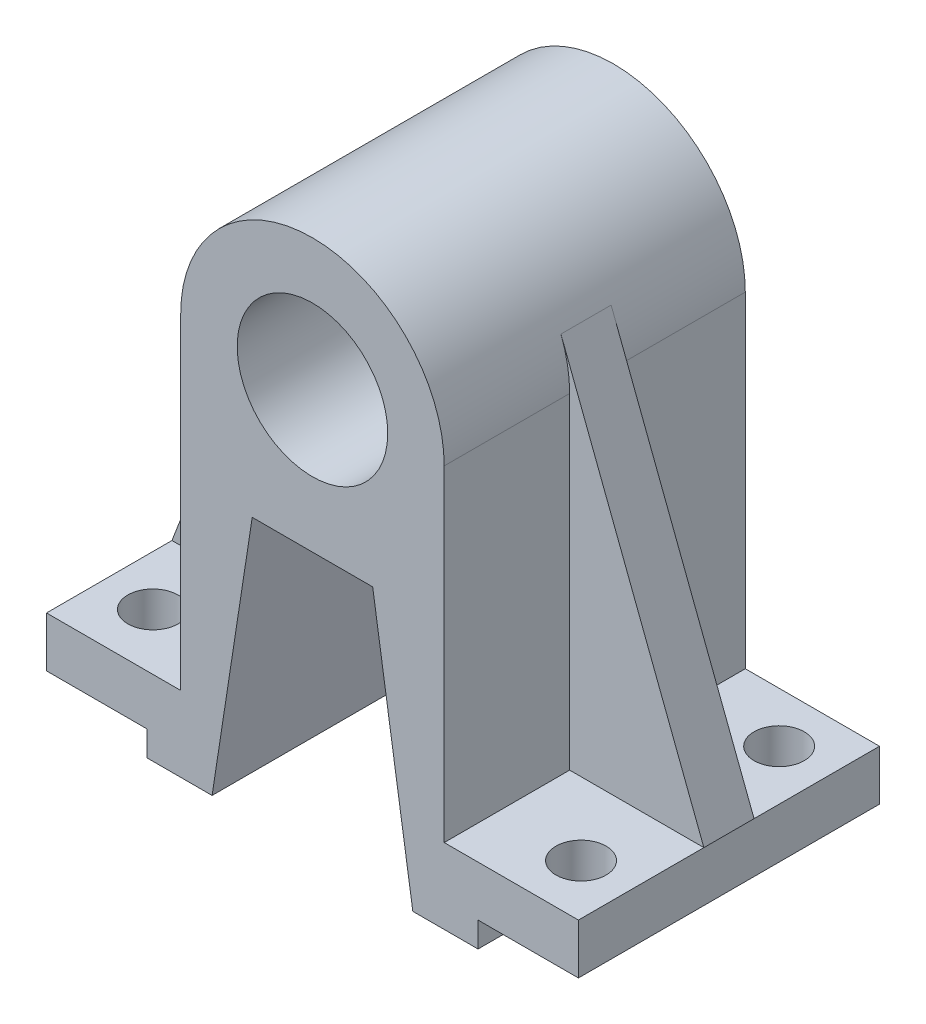
ISO-10303-21;
HEADER;
FILE_DESCRIPTION(('STEP AP214'),'2;1');
FILE_NAME('part.step','',(''),(''),'','','');
FILE_SCHEMA(('AUTOMOTIVE_DESIGN { 1 0 10303 214 1 1 1 1 }'));
ENDSEC;
DATA;
#1=APPLICATION_CONTEXT('core data for automotive mechanical design processes');
#2=APPLICATION_PROTOCOL_DEFINITION('international standard','automotive_design',2000,#1);
#3=PRODUCT_CONTEXT('',#1,'mechanical');
#4=PRODUCT('Part','Part','',(#3));
#5=PRODUCT_RELATED_PRODUCT_CATEGORY('part','',(#4));
#6=PRODUCT_DEFINITION_FORMATION('','',#4);
#7=PRODUCT_DEFINITION_CONTEXT('part definition',#1,'design');
#8=PRODUCT_DEFINITION('design','',#6,#7);
#9=PRODUCT_DEFINITION_SHAPE('','',#8);
#10=(LENGTH_UNIT() NAMED_UNIT(*) SI_UNIT(.MILLI.,.METRE.));
#11=(NAMED_UNIT(*) PLANE_ANGLE_UNIT() SI_UNIT($,.RADIAN.));
#12=(NAMED_UNIT(*) SI_UNIT($,.STERADIAN.) SOLID_ANGLE_UNIT());
#13=UNCERTAINTY_MEASURE_WITH_UNIT(LENGTH_MEASURE(1.E-05),#10,'distance_accuracy_value','');
#14=(GEOMETRIC_REPRESENTATION_CONTEXT(3) GLOBAL_UNCERTAINTY_ASSIGNED_CONTEXT((#13)) GLOBAL_UNIT_ASSIGNED_CONTEXT((#10,
#11,#12)) REPRESENTATION_CONTEXT('',''));
#15=CARTESIAN_POINT('',(0.,0.,0.));
#16=DIRECTION('',(0.,0.,1.));
#17=DIRECTION('',(1.,0.,0.));
#18=AXIS2_PLACEMENT_3D('',#15,#16,#17);
#19=CARTESIAN_POINT('',(0.,-60.2504582340665,-30.));
#20=DIRECTION('',(0.,-1.,0.));
#21=DIRECTION('',(0.,0.,-1.));
#22=AXIS2_PLACEMENT_3D('',#19,#20,#21);
#23=PLANE('',#22);
#24=CARTESIAN_POINT('',(-44.4977725785209,-60.2504582340665,-20.));
#25=DIRECTION('',(0.,1.,0.));
#26=DIRECTION('',(0.,0.,1.));
#27=AXIS2_PLACEMENT_3D('',#24,#25,#26);
#28=CIRCLE('',#27,5.);
#29=CARTESIAN_POINT('',(-44.4977725785209,-60.2504582340665,-15.));
#30=VERTEX_POINT('',#29);
#31=EDGE_CURVE('E308',#30,#30,#28,.T.);
#32=ORIENTED_EDGE('',*,*,#31,.F.);
#33=EDGE_LOOP('',(#32));
#34=FACE_BOUND('',#33,.T.);
#35=DIRECTION('',(1.,0.,0.));
#36=VECTOR('',#35,1.);
#37=CARTESIAN_POINT('',(-26.8889773387645,-60.2504582340665,-5.));
#38=LINE('',#37,#36);
#39=CARTESIAN_POINT('',(-54.4977725785209,-60.2504582340665,-5.));
#40=VERTEX_POINT('',#39);
#41=CARTESIAN_POINT('',(-27.7507042967795,-60.2504582340665,-5.));
#42=VERTEX_POINT('',#41);
#43=EDGE_CURVE('E476',#40,#42,#38,.T.);
#44=ORIENTED_EDGE('',*,*,#43,.T.);
#45=DIRECTION('',(0.,0.,1.));
#46=VECTOR('',#45,1.);
#47=CARTESIAN_POINT('',(-27.7507042967795,-60.2504582340665,-30.));
#48=LINE('',#47,#46);
#49=CARTESIAN_POINT('',(-27.7507042967795,-60.2504582340665,-30.));
#50=VERTEX_POINT('',#49);
#51=EDGE_CURVE('E455',#50,#42,#48,.T.);
#52=ORIENTED_EDGE('',*,*,#51,.F.);
#53=DIRECTION('',(1.,0.,0.));
#54=VECTOR('',#53,1.);
#55=CARTESIAN_POINT('',(0.,-60.2504582340665,-30.));
#56=LINE('',#55,#54);
#57=CARTESIAN_POINT('',(-54.4977725785209,-60.2504582340665,-30.));
#58=VERTEX_POINT('',#57);
#59=EDGE_CURVE('E351',#58,#50,#56,.T.);
#60=ORIENTED_EDGE('',*,*,#59,.F.);
#61=DIRECTION('',(0.,0.,1.));
#62=VECTOR('',#61,1.);
#63=CARTESIAN_POINT('',(-54.4977725785209,-60.2504582340665,-30.));
#64=LINE('',#63,#62);
#65=EDGE_CURVE('E451',#58,#40,#64,.T.);
#66=ORIENTED_EDGE('',*,*,#65,.T.);
#67=EDGE_LOOP('',(#44,#52,#60,#66));
#68=FACE_BOUND('',#67,.T.);
#69=ADVANCED_FACE('F99',(#34,#68),#23,.F.);
#70=CARTESIAN_POINT('',(-27.7507042967795,0.,-30.));
#71=DIRECTION('',(-1.,0.,0.));
#72=DIRECTION('',(0.,-1.,0.));
#73=AXIS2_PLACEMENT_3D('',#70,#71,#72);
#74=PLANE('',#73);
#75=ORIENTED_EDGE('',*,*,#51,.T.);
#76=DIRECTION('',(0.,1.,0.));
#77=VECTOR('',#76,1.);
#78=CARTESIAN_POINT('',(-27.7507042967795,0.,-5.));
#79=LINE('',#78,#77);
#80=CARTESIAN_POINT('',(-27.7507042967795,4.74954176593344,-5.));
#81=VERTEX_POINT('',#80);
#82=EDGE_CURVE('E107',#42,#81,#79,.T.);
#83=ORIENTED_EDGE('',*,*,#82,.T.);
#84=DIRECTION('',(0.,0.,1.));
#85=VECTOR('',#84,1.);
#86=CARTESIAN_POINT('',(-27.7507042967795,4.74954176593344,-30.));
#87=LINE('',#86,#85);
#88=CARTESIAN_POINT('',(-27.7507042967795,4.74954176593344,-30.));
#89=VERTEX_POINT('',#88);
#90=EDGE_CURVE('E342',#89,#81,#87,.T.);
#91=ORIENTED_EDGE('',*,*,#90,.F.);
#92=DIRECTION('',(0.,-1.,0.));
#93=VECTOR('',#92,1.);
#94=CARTESIAN_POINT('',(-27.7507042967795,0.,-30.));
#95=LINE('',#94,#93);
#96=EDGE_CURVE('E348',#89,#50,#95,.T.);
#97=ORIENTED_EDGE('',*,*,#96,.T.);
#98=EDGE_LOOP('',(#75,#83,#91,#97));
#99=FACE_BOUND('',#98,.T.);
#100=ADVANCED_FACE('F462',(#99),#74,.T.);
#101=CARTESIAN_POINT('',(0.,-60.2504582340665,-30.));
#102=DIRECTION('',(0.,-1.,0.));
#103=DIRECTION('',(0.,0.,-1.));
#104=AXIS2_PLACEMENT_3D('',#101,#102,#103);
#105=PLANE('',#104);
#106=CARTESIAN_POINT('',(41.5022274214791,-60.2504582340665,-20.));
#107=DIRECTION('',(0.,1.,0.));
#108=DIRECTION('',(0.,0.,1.));
#109=AXIS2_PLACEMENT_3D('',#106,#107,#108);
#110=CIRCLE('',#109,5.);
#111=CARTESIAN_POINT('',(41.5022274214791,-60.2504582340665,-15.));
#112=VERTEX_POINT('',#111);
#113=EDGE_CURVE('E304',#112,#112,#110,.T.);
#114=ORIENTED_EDGE('',*,*,#113,.F.);
#115=EDGE_LOOP('',(#114));
#116=FACE_BOUND('',#115,.T.);
#117=DIRECTION('',(1.,0.,0.));
#118=VECTOR('',#117,1.);
#119=CARTESIAN_POINT('',(51.5022274214791,-60.2504582340665,-5.));
#120=LINE('',#119,#118);
#121=CARTESIAN_POINT('',(24.7551591397377,-60.2504582340665,-5.));
#122=VERTEX_POINT('',#121);
#123=CARTESIAN_POINT('',(51.5022274214791,-60.2504582340665,-5.));
#124=VERTEX_POINT('',#123);
#125=EDGE_CURVE('E268',#122,#124,#120,.T.);
#126=ORIENTED_EDGE('',*,*,#125,.T.);
#127=DIRECTION('',(0.,0.,1.));
#128=VECTOR('',#127,1.);
#129=CARTESIAN_POINT('',(51.5022274214791,-60.2504582340665,-30.));
#130=LINE('',#129,#128);
#131=CARTESIAN_POINT('',(51.5022274214791,-60.2504582340665,-30.));
#132=VERTEX_POINT('',#131);
#133=EDGE_CURVE('E417',#132,#124,#130,.T.);
#134=ORIENTED_EDGE('',*,*,#133,.F.);
#135=DIRECTION('',(1.,0.,0.));
#136=VECTOR('',#135,1.);
#137=CARTESIAN_POINT('',(0.,-60.2504582340665,-30.));
#138=LINE('',#137,#136);
#139=CARTESIAN_POINT('',(24.7551591397377,-60.2504582340665,-30.));
#140=VERTEX_POINT('',#139);
#141=EDGE_CURVE('E376',#140,#132,#138,.T.);
#142=ORIENTED_EDGE('',*,*,#141,.F.);
#143=DIRECTION('',(0.,0.,1.));
#144=VECTOR('',#143,1.);
#145=CARTESIAN_POINT('',(24.7551591397377,-60.2504582340665,-30.));
#146=LINE('',#145,#144);
#147=EDGE_CURVE('E341',#140,#122,#146,.T.);
#148=ORIENTED_EDGE('',*,*,#147,.T.);
#149=EDGE_LOOP('',(#126,#134,#142,#148));
#150=FACE_BOUND('',#149,.T.);
#151=ADVANCED_FACE('F510',(#116,#150),#105,.F.);
#152=CARTESIAN_POINT('',(24.7551591397378,0.,-30.));
#153=DIRECTION('',(-1.,0.,0.));
#154=DIRECTION('',(0.,-1.,0.));
#155=AXIS2_PLACEMENT_3D('',#152,#153,#154);
#156=PLANE('',#155);
#157=DIRECTION('',(0.,1.,0.));
#158=VECTOR('',#157,1.);
#159=CARTESIAN_POINT('',(24.7551591397378,0.,-5.));
#160=LINE('',#159,#158);
#161=CARTESIAN_POINT('',(24.7551591397378,4.74954176593344,-5.));
#162=VERTEX_POINT('',#161);
#163=EDGE_CURVE('E344',#122,#162,#160,.T.);
#164=ORIENTED_EDGE('',*,*,#163,.F.);
#165=ORIENTED_EDGE('',*,*,#147,.F.);
#166=DIRECTION('',(0.,-1.,0.));
#167=VECTOR('',#166,1.);
#168=CARTESIAN_POINT('',(24.7551591397378,0.,-30.));
#169=LINE('',#168,#167);
#170=CARTESIAN_POINT('',(24.7551591397378,4.74954176593344,-30.));
#171=VERTEX_POINT('',#170);
#172=EDGE_CURVE('E378',#171,#140,#169,.T.);
#173=ORIENTED_EDGE('',*,*,#172,.F.);
#174=DIRECTION('',(0.,0.,1.));
#175=VECTOR('',#174,1.);
#176=CARTESIAN_POINT('',(24.7551591397378,4.74954176593344,-30.));
#177=LINE('',#176,#175);
#178=EDGE_CURVE('E346',#171,#162,#177,.T.);
#179=ORIENTED_EDGE('',*,*,#178,.T.);
#180=EDGE_LOOP('',(#164,#165,#173,#179));
#181=FACE_BOUND('',#180,.T.);
#182=ADVANCED_FACE('F507',(#181),#156,.F.);
#183=CARTESIAN_POINT('',(-1.49777257852089,4.74954176593344,-30.));
#184=DIRECTION('',(0.,0.,1.));
#185=DIRECTION('',(1.,0.,0.));
#186=AXIS2_PLACEMENT_3D('',#183,#184,#185);
#187=CYLINDRICAL_SURFACE('',#186,26.2529317182586);
#188=CARTESIAN_POINT('',(-1.49777257852089,4.74954176593344,5.));
#189=DIRECTION('',(0.,0.,1.));
#190=DIRECTION('',(1.,0.,0.));
#191=AXIS2_PLACEMENT_3D('',#188,#189,#190);
#192=CIRCLE('',#191,26.2529317182586);
#193=CARTESIAN_POINT('',(-27.7507042967795,4.74954176593344,5.));
#194=VERTEX_POINT('',#193);
#195=CARTESIAN_POINT('',(-26.8889773387645,11.4206094935865,5.));
#196=VERTEX_POINT('',#195);
#197=EDGE_CURVE('E260',#194,#196,#192,.F.);
#198=ORIENTED_EDGE('',*,*,#197,.F.);
#199=CARTESIAN_POINT('',(-27.7507042967795,4.74954176593344,30.));
#200=VERTEX_POINT('',#199);
#201=EDGE_CURVE('E345',#194,#200,#87,.T.);
#202=ORIENTED_EDGE('',*,*,#201,.T.);
#203=CARTESIAN_POINT('',(-1.49777257852089,4.74954176593344,30.));
#204=DIRECTION('',(0.,0.,1.));
#205=DIRECTION('',(1.,0.,0.));
#206=AXIS2_PLACEMENT_3D('',#203,#204,#205);
#207=CIRCLE('',#206,26.2529317182586);
#208=CARTESIAN_POINT('',(24.7551591397378,4.74954176593344,30.));
#209=VERTEX_POINT('',#208);
#210=EDGE_CURVE('E338',#209,#200,#207,.T.);
#211=ORIENTED_EDGE('',*,*,#210,.F.);
#212=CARTESIAN_POINT('',(24.7551591397378,4.74954176593344,5.));
#213=VERTEX_POINT('',#212);
#214=EDGE_CURVE('E337',#213,#209,#177,.T.);
#215=ORIENTED_EDGE('',*,*,#214,.F.);
#216=CARTESIAN_POINT('',(-1.49777257852089,4.74954176593344,5.));
#217=DIRECTION('',(0.,0.,1.));
#218=DIRECTION('',(1.,0.,0.));
#219=AXIS2_PLACEMENT_3D('',#216,#217,#218);
#220=CIRCLE('',#219,26.2529317182586);
#221=CARTESIAN_POINT('',(23.0193645472082,14.1371085945502,5.));
#222=VERTEX_POINT('',#221);
#223=EDGE_CURVE('E122',#222,#213,#220,.F.);
#224=ORIENTED_EDGE('',*,*,#223,.F.);
#225=DIRECTION('',(0.,0.,-1.));
#226=VECTOR('',#225,1.);
#227=CARTESIAN_POINT('',(23.0193645472082,14.1371085945502,5.));
#228=LINE('',#227,#226);
#229=CARTESIAN_POINT('',(23.0193645472082,14.1371085945502,-5.));
#230=VERTEX_POINT('',#229);
#231=EDGE_CURVE('E291',#222,#230,#228,.T.);
#232=ORIENTED_EDGE('',*,*,#231,.T.);
#233=CARTESIAN_POINT('',(-1.49777257852089,4.74954176593344,-5.));
#234=DIRECTION('',(0.,0.,1.));
#235=DIRECTION('',(1.,0.,0.));
#236=AXIS2_PLACEMENT_3D('',#233,#234,#235);
#237=CIRCLE('',#236,26.2529317182586);
#238=EDGE_CURVE('E299',#230,#162,#237,.F.);
#239=ORIENTED_EDGE('',*,*,#238,.T.);
#240=ORIENTED_EDGE('',*,*,#178,.F.);
#241=CARTESIAN_POINT('',(-1.49777257852089,4.74954176593344,-30.));
#242=DIRECTION('',(0.,0.,1.));
#243=DIRECTION('',(1.,0.,0.));
#244=AXIS2_PLACEMENT_3D('',#241,#242,#243);
#245=CIRCLE('',#244,26.2529317182586);
#246=EDGE_CURVE('E334',#171,#89,#245,.T.);
#247=ORIENTED_EDGE('',*,*,#246,.T.);
#248=ORIENTED_EDGE('',*,*,#90,.T.);
#249=CARTESIAN_POINT('',(-1.49777257852089,4.74954176593344,-5.));
#250=DIRECTION('',(0.,0.,1.));
#251=DIRECTION('',(1.,0.,0.));
#252=AXIS2_PLACEMENT_3D('',#249,#250,#251);
#253=CIRCLE('',#252,26.2529317182586);
#254=CARTESIAN_POINT('',(-26.8889773387645,11.4206094935865,-5.));
#255=VERTEX_POINT('',#254);
#256=EDGE_CURVE('E114',#81,#255,#253,.F.);
#257=ORIENTED_EDGE('',*,*,#256,.T.);
#258=DIRECTION('',(0.,0.,-1.));
#259=VECTOR('',#258,1.);
#260=CARTESIAN_POINT('',(-26.8889773387645,11.4206094935865,5.));
#261=LINE('',#260,#259);
#262=EDGE_CURVE('E272',#196,#255,#261,.T.);
#263=ORIENTED_EDGE('',*,*,#262,.F.);
#264=EDGE_LOOP('',(#198,#202,#211,#215,#224,#232,#239,#240,#247,#248,#257,#263));
#265=FACE_BOUND('',#264,.T.);
#266=ADVANCED_FACE('F278',(#265),#187,.T.);
#267=CARTESIAN_POINT('',(0.,0.,30.));
#268=DIRECTION('',(0.,0.,1.));
#269=DIRECTION('',(1.,0.,0.));
#270=AXIS2_PLACEMENT_3D('',#267,#268,#269);
#271=PLANE('',#270);
#272=CARTESIAN_POINT('',(-1.49777257852089,4.74954176593344,30.));
#273=DIRECTION('',(0.,0.,1.));
#274=DIRECTION('',(1.,0.,0.));
#275=AXIS2_PLACEMENT_3D('',#272,#273,#274);
#276=CIRCLE('',#275,15.);
#277=CARTESIAN_POINT('',(13.5022274214791,4.74954176593344,30.));
#278=VERTEX_POINT('',#277);
#279=EDGE_CURVE('E327',#278,#278,#276,.T.);
#280=ORIENTED_EDGE('',*,*,#279,.F.);
#281=EDGE_LOOP('',(#280));
#282=FACE_BOUND('',#281,.T.);
#283=ORIENTED_EDGE('',*,*,#210,.T.);
#284=DIRECTION('',(0.,-1.,0.));
#285=VECTOR('',#284,1.);
#286=CARTESIAN_POINT('',(-27.7507042967795,0.,30.));
#287=LINE('',#286,#285);
#288=CARTESIAN_POINT('',(-27.7507042967795,-60.2504582340665,30.));
#289=VERTEX_POINT('',#288);
#290=EDGE_CURVE('E331',#200,#289,#287,.T.);
#291=ORIENTED_EDGE('',*,*,#290,.T.);
#292=DIRECTION('',(1.,0.,0.));
#293=VECTOR('',#292,1.);
#294=CARTESIAN_POINT('',(0.,-60.2504582340665,30.));
#295=LINE('',#294,#293);
#296=CARTESIAN_POINT('',(-54.4977725785209,-60.2504582340665,30.));
#297=VERTEX_POINT('',#296);
#298=EDGE_CURVE('E383',#297,#289,#295,.T.);
#299=ORIENTED_EDGE('',*,*,#298,.F.);
#300=DIRECTION('',(0.,1.,0.));
#301=VECTOR('',#300,1.);
#302=CARTESIAN_POINT('',(-54.497772578521,0.,30.));
#303=LINE('',#302,#301);
#304=CARTESIAN_POINT('',(-54.4977725785209,-70.2504582340665,30.));
#305=VERTEX_POINT('',#304);
#306=EDGE_CURVE('E386',#305,#297,#303,.T.);
#307=ORIENTED_EDGE('',*,*,#306,.F.);
#308=DIRECTION('',(-1.,0.,0.));
#309=VECTOR('',#308,1.);
#310=CARTESIAN_POINT('',(0.,-70.2504582340666,30.));
#311=LINE('',#310,#309);
#312=CARTESIAN_POINT('',(-34.4977725785209,-70.2504582340666,30.));
#313=VERTEX_POINT('',#312);
#314=EDGE_CURVE('E389',#313,#305,#311,.T.);
#315=ORIENTED_EDGE('',*,*,#314,.F.);
#316=DIRECTION('',(0.,1.,0.));
#317=VECTOR('',#316,1.);
#318=CARTESIAN_POINT('',(-34.4977725785209,0.,30.));
#319=LINE('',#318,#317);
#320=CARTESIAN_POINT('',(-34.4977725785209,-75.2504582340666,30.));
#321=VERTEX_POINT('',#320);
#322=EDGE_CURVE('E391',#321,#313,#319,.T.);
#323=ORIENTED_EDGE('',*,*,#322,.F.);
#324=DIRECTION('',(-1.,0.,0.));
#325=VECTOR('',#324,1.);
#326=CARTESIAN_POINT('',(0.,-75.2504582340666,30.));
#327=LINE('',#326,#325);
#328=CARTESIAN_POINT('',(-21.4977725785209,-75.2504582340666,30.));
#329=VERTEX_POINT('',#328);
#330=EDGE_CURVE('E393',#329,#321,#327,.T.);
#331=ORIENTED_EDGE('',*,*,#330,.F.);
#332=DIRECTION('',(-0.152057184253941,-0.988371697650617,0.));
#333=VECTOR('',#332,1.);
#334=CARTESIAN_POINT('',(-9.69139683054509,1.49098412777617,30.));
#335=LINE('',#334,#333);
#336=CARTESIAN_POINT('',(-13.4977725785209,-23.2504582340666,30.));
#337=VERTEX_POINT('',#336);
#338=EDGE_CURVE('E395',#337,#329,#335,.T.);
#339=ORIENTED_EDGE('',*,*,#338,.F.);
#340=DIRECTION('',(-1.,0.,0.));
#341=VECTOR('',#340,1.);
#342=CARTESIAN_POINT('',(0.,-23.2504582340666,30.));
#343=LINE('',#342,#341);
#344=CARTESIAN_POINT('',(10.5022274214791,-23.2504582340666,30.));
#345=VERTEX_POINT('',#344);
#346=EDGE_CURVE('E397',#345,#337,#343,.T.);
#347=ORIENTED_EDGE('',*,*,#346,.F.);
#348=DIRECTION('',(-0.152057184253941,0.988371697650617,0.));
#349=VECTOR('',#348,1.);
#350=CARTESIAN_POINT('',(6.76511283320369,1.04078658972364,30.));
#351=LINE('',#350,#349);
#352=CARTESIAN_POINT('',(18.5022274214791,-75.2504582340666,30.));
#353=VERTEX_POINT('',#352);
#354=EDGE_CURVE('E399',#353,#345,#351,.T.);
#355=ORIENTED_EDGE('',*,*,#354,.F.);
#356=DIRECTION('',(-1.,0.,0.));
#357=VECTOR('',#356,1.);
#358=CARTESIAN_POINT('',(0.,-75.2504582340666,30.));
#359=LINE('',#358,#357);
#360=CARTESIAN_POINT('',(31.5022274214791,-75.2504582340666,30.));
#361=VERTEX_POINT('',#360);
#362=EDGE_CURVE('E401',#361,#353,#359,.T.);
#363=ORIENTED_EDGE('',*,*,#362,.F.);
#364=DIRECTION('',(0.,-1.,0.));
#365=VECTOR('',#364,1.);
#366=CARTESIAN_POINT('',(31.5022274214791,0.,30.));
#367=LINE('',#366,#365);
#368=CARTESIAN_POINT('',(31.5022274214791,-70.2504582340666,30.));
#369=VERTEX_POINT('',#368);
#370=EDGE_CURVE('E403',#369,#361,#367,.T.);
#371=ORIENTED_EDGE('',*,*,#370,.F.);
#372=DIRECTION('',(-1.,0.,0.));
#373=VECTOR('',#372,1.);
#374=CARTESIAN_POINT('',(0.,-70.2504582340666,30.));
#375=LINE('',#374,#373);
#376=CARTESIAN_POINT('',(51.5022274214791,-70.2504582340665,30.));
#377=VERTEX_POINT('',#376);
#378=EDGE_CURVE('E405',#377,#369,#375,.T.);
#379=ORIENTED_EDGE('',*,*,#378,.F.);
#380=DIRECTION('',(0.,-1.,0.));
#381=VECTOR('',#380,1.);
#382=CARTESIAN_POINT('',(51.5022274214792,0.,30.));
#383=LINE('',#382,#381);
#384=CARTESIAN_POINT('',(51.5022274214791,-60.2504582340665,30.));
#385=VERTEX_POINT('',#384);
#386=EDGE_CURVE('E407',#385,#377,#383,.T.);
#387=ORIENTED_EDGE('',*,*,#386,.F.);
#388=DIRECTION('',(1.,0.,0.));
#389=VECTOR('',#388,1.);
#390=CARTESIAN_POINT('',(0.,-60.2504582340665,30.));
#391=LINE('',#390,#389);
#392=CARTESIAN_POINT('',(24.7551591397377,-60.2504582340665,30.));
#393=VERTEX_POINT('',#392);
#394=EDGE_CURVE('E409',#393,#385,#391,.T.);
#395=ORIENTED_EDGE('',*,*,#394,.F.);
#396=DIRECTION('',(0.,-1.,0.));
#397=VECTOR('',#396,1.);
#398=CARTESIAN_POINT('',(24.7551591397378,0.,30.));
#399=LINE('',#398,#397);
#400=EDGE_CURVE('E352',#209,#393,#399,.T.);
#401=ORIENTED_EDGE('',*,*,#400,.F.);
#402=EDGE_LOOP('',(#283,#291,#299,#307,#315,#323,#331,#339,#347,#355,#363,#371,#379,#387,#395,#401));
#403=FACE_BOUND('',#402,.T.);
#404=ADVANCED_FACE('F489',(#282,#403),#271,.T.);
#405=CARTESIAN_POINT('',(0.,0.,-30.));
#406=DIRECTION('',(0.,0.,1.));
#407=DIRECTION('',(1.,0.,0.));
#408=AXIS2_PLACEMENT_3D('',#405,#406,#407);
#409=PLANE('',#408);
#410=CARTESIAN_POINT('',(-1.49777257852089,4.74954176593344,-30.));
#411=DIRECTION('',(0.,0.,1.));
#412=DIRECTION('',(1.,0.,0.));
#413=AXIS2_PLACEMENT_3D('',#410,#411,#412);
#414=CIRCLE('',#413,15.);
#415=CARTESIAN_POINT('',(13.5022274214791,4.74954176593344,-30.));
#416=VERTEX_POINT('',#415);
#417=EDGE_CURVE('E328',#416,#416,#414,.T.);
#418=ORIENTED_EDGE('',*,*,#417,.T.);
#419=EDGE_LOOP('',(#418));
#420=FACE_BOUND('',#419,.T.);
#421=ORIENTED_EDGE('',*,*,#246,.F.);
#422=ORIENTED_EDGE('',*,*,#172,.T.);
#423=ORIENTED_EDGE('',*,*,#141,.T.);
#424=DIRECTION('',(0.,-1.,0.));
#425=VECTOR('',#424,1.);
#426=CARTESIAN_POINT('',(51.5022274214792,0.,-30.));
#427=LINE('',#426,#425);
#428=CARTESIAN_POINT('',(51.5022274214791,-70.2504582340665,-30.));
#429=VERTEX_POINT('',#428);
#430=EDGE_CURVE('E374',#132,#429,#427,.T.);
#431=ORIENTED_EDGE('',*,*,#430,.T.);
#432=DIRECTION('',(-1.,0.,0.));
#433=VECTOR('',#432,1.);
#434=CARTESIAN_POINT('',(0.,-70.2504582340666,-30.));
#435=LINE('',#434,#433);
#436=CARTESIAN_POINT('',(31.5022274214791,-70.2504582340666,-30.));
#437=VERTEX_POINT('',#436);
#438=EDGE_CURVE('E372',#429,#437,#435,.T.);
#439=ORIENTED_EDGE('',*,*,#438,.T.);
#440=DIRECTION('',(0.,-1.,0.));
#441=VECTOR('',#440,1.);
#442=CARTESIAN_POINT('',(31.5022274214791,0.,-30.));
#443=LINE('',#442,#441);
#444=CARTESIAN_POINT('',(31.5022274214791,-75.2504582340666,-30.));
#445=VERTEX_POINT('',#444);
#446=EDGE_CURVE('E370',#437,#445,#443,.T.);
#447=ORIENTED_EDGE('',*,*,#446,.T.);
#448=DIRECTION('',(-1.,0.,0.));
#449=VECTOR('',#448,1.);
#450=CARTESIAN_POINT('',(0.,-75.2504582340666,-30.));
#451=LINE('',#450,#449);
#452=CARTESIAN_POINT('',(18.5022274214791,-75.2504582340666,-30.));
#453=VERTEX_POINT('',#452);
#454=EDGE_CURVE('E368',#445,#453,#451,.T.);
#455=ORIENTED_EDGE('',*,*,#454,.T.);
#456=DIRECTION('',(-0.152057184253941,0.988371697650617,0.));
#457=VECTOR('',#456,1.);
#458=CARTESIAN_POINT('',(6.76511283320369,1.04078658972364,-30.));
#459=LINE('',#458,#457);
#460=CARTESIAN_POINT('',(10.5022274214791,-23.2504582340666,-30.));
#461=VERTEX_POINT('',#460);
#462=EDGE_CURVE('E366',#453,#461,#459,.T.);
#463=ORIENTED_EDGE('',*,*,#462,.T.);
#464=DIRECTION('',(-1.,0.,0.));
#465=VECTOR('',#464,1.);
#466=CARTESIAN_POINT('',(0.,-23.2504582340666,-30.));
#467=LINE('',#466,#465);
#468=CARTESIAN_POINT('',(-13.4977725785209,-23.2504582340666,-30.));
#469=VERTEX_POINT('',#468);
#470=EDGE_CURVE('E364',#461,#469,#467,.T.);
#471=ORIENTED_EDGE('',*,*,#470,.T.);
#472=DIRECTION('',(-0.152057184253941,-0.988371697650617,0.));
#473=VECTOR('',#472,1.);
#474=CARTESIAN_POINT('',(-9.69139683054509,1.49098412777617,-30.));
#475=LINE('',#474,#473);
#476=CARTESIAN_POINT('',(-21.4977725785209,-75.2504582340666,-30.));
#477=VERTEX_POINT('',#476);
#478=EDGE_CURVE('E362',#469,#477,#475,.T.);
#479=ORIENTED_EDGE('',*,*,#478,.T.);
#480=DIRECTION('',(-1.,0.,0.));
#481=VECTOR('',#480,1.);
#482=CARTESIAN_POINT('',(0.,-75.2504582340666,-30.));
#483=LINE('',#482,#481);
#484=CARTESIAN_POINT('',(-34.4977725785209,-75.2504582340666,-30.));
#485=VERTEX_POINT('',#484);
#486=EDGE_CURVE('E360',#477,#485,#483,.T.);
#487=ORIENTED_EDGE('',*,*,#486,.T.);
#488=DIRECTION('',(0.,1.,0.));
#489=VECTOR('',#488,1.);
#490=CARTESIAN_POINT('',(-34.4977725785209,0.,-30.));
#491=LINE('',#490,#489);
#492=CARTESIAN_POINT('',(-34.4977725785209,-70.2504582340666,-30.));
#493=VERTEX_POINT('',#492);
#494=EDGE_CURVE('E358',#485,#493,#491,.T.);
#495=ORIENTED_EDGE('',*,*,#494,.T.);
#496=DIRECTION('',(-1.,0.,0.));
#497=VECTOR('',#496,1.);
#498=CARTESIAN_POINT('',(0.,-70.2504582340666,-30.));
#499=LINE('',#498,#497);
#500=CARTESIAN_POINT('',(-54.4977725785209,-70.2504582340665,-30.));
#501=VERTEX_POINT('',#500);
#502=EDGE_CURVE('E356',#493,#501,#499,.T.);
#503=ORIENTED_EDGE('',*,*,#502,.T.);
#504=DIRECTION('',(0.,1.,0.));
#505=VECTOR('',#504,1.);
#506=CARTESIAN_POINT('',(-54.497772578521,0.,-30.));
#507=LINE('',#506,#505);
#508=EDGE_CURVE('E354',#501,#58,#507,.T.);
#509=ORIENTED_EDGE('',*,*,#508,.T.);
#510=ORIENTED_EDGE('',*,*,#59,.T.);
#511=ORIENTED_EDGE('',*,*,#96,.F.);
#512=EDGE_LOOP('',(#421,#422,#423,#431,#439,#447,#455,#463,#471,#479,#487,#495,#503,#509,#510,#511));
#513=FACE_BOUND('',#512,.T.);
#514=ADVANCED_FACE('F470',(#420,#513),#409,.F.);
#515=CARTESIAN_POINT('',(51.5022274214792,0.,-30.));
#516=DIRECTION('',(-1.,0.,0.));
#517=DIRECTION('',(0.,-1.,0.));
#518=AXIS2_PLACEMENT_3D('',#515,#516,#517);
#519=PLANE('',#518);
#520=ORIENTED_EDGE('',*,*,#386,.T.);
#521=DIRECTION('',(0.,0.,1.));
#522=VECTOR('',#521,1.);
#523=CARTESIAN_POINT('',(51.5022274214791,-70.2504582340665,-30.));
#524=LINE('',#523,#522);
#525=EDGE_CURVE('E421',#429,#377,#524,.T.);
#526=ORIENTED_EDGE('',*,*,#525,.F.);
#527=ORIENTED_EDGE('',*,*,#430,.F.);
#528=ORIENTED_EDGE('',*,*,#133,.T.);
#529=DIRECTION('',(0.,0.,-1.));
#530=VECTOR('',#529,1.);
#531=CARTESIAN_POINT('',(51.5022274214791,-60.2504582340665,5.));
#532=LINE('',#531,#530);
#533=CARTESIAN_POINT('',(51.5022274214791,-60.2504582340665,5.));
#534=VERTEX_POINT('',#533);
#535=EDGE_CURVE('E296',#534,#124,#532,.T.);
#536=ORIENTED_EDGE('',*,*,#535,.F.);
#537=EDGE_CURVE('E420',#534,#385,#130,.T.);
#538=ORIENTED_EDGE('',*,*,#537,.T.);
#539=EDGE_LOOP('',(#520,#526,#527,#528,#536,#538));
#540=FACE_BOUND('',#539,.T.);
#541=ADVANCED_FACE('F517',(#540),#519,.F.);
#542=CARTESIAN_POINT('',(0.,-70.2504582340666,-30.));
#543=DIRECTION('',(0.,1.,0.));
#544=DIRECTION('',(-1.,0.,0.));
#545=AXIS2_PLACEMENT_3D('',#542,#543,#544);
#546=PLANE('',#545);
#547=CARTESIAN_POINT('',(41.5022274214791,-70.2504582340666,-20.));
#548=DIRECTION('',(0.,1.,0.));
#549=DIRECTION('',(-1.,0.,0.));
#550=AXIS2_PLACEMENT_3D('',#547,#548,#549);
#551=CIRCLE('',#550,5.);
#552=CARTESIAN_POINT('',(36.5022274214791,-70.2504582340666,-20.));
#553=VERTEX_POINT('',#552);
#554=EDGE_CURVE('E324',#553,#553,#551,.T.);
#555=ORIENTED_EDGE('',*,*,#554,.T.);
#556=EDGE_LOOP('',(#555));
#557=FACE_BOUND('',#556,.T.);
#558=CARTESIAN_POINT('',(41.5022274214791,-70.2504582340666,19.4758385656871));
#559=DIRECTION('',(0.,1.,0.));
#560=DIRECTION('',(-1.,0.,0.));
#561=AXIS2_PLACEMENT_3D('',#558,#559,#560);
#562=CIRCLE('',#561,5.);
#563=CARTESIAN_POINT('',(36.5022274214791,-70.2504582340666,19.4758385656871));
#564=VERTEX_POINT('',#563);
#565=EDGE_CURVE('E321',#564,#564,#562,.T.);
#566=ORIENTED_EDGE('',*,*,#565,.T.);
#567=EDGE_LOOP('',(#566));
#568=FACE_BOUND('',#567,.T.);
#569=ORIENTED_EDGE('',*,*,#378,.T.);
#570=DIRECTION('',(0.,0.,1.));
#571=VECTOR('',#570,1.);
#572=CARTESIAN_POINT('',(31.5022274214791,-70.2504582340666,-30.));
#573=LINE('',#572,#571);
#574=EDGE_CURVE('E424',#437,#369,#573,.T.);
#575=ORIENTED_EDGE('',*,*,#574,.F.);
#576=ORIENTED_EDGE('',*,*,#438,.F.);
#577=ORIENTED_EDGE('',*,*,#525,.T.);
#578=EDGE_LOOP('',(#569,#575,#576,#577));
#579=FACE_BOUND('',#578,.T.);
#580=ADVANCED_FACE('F521',(#557,#568,#579),#546,.F.);
#581=CARTESIAN_POINT('',(31.5022274214791,0.,-30.));
#582=DIRECTION('',(-1.,0.,0.));
#583=DIRECTION('',(0.,0.,1.));
#584=AXIS2_PLACEMENT_3D('',#581,#582,#583);
#585=PLANE('',#584);
#586=ORIENTED_EDGE('',*,*,#370,.T.);
#587=DIRECTION('',(0.,0.,1.));
#588=VECTOR('',#587,1.);
#589=CARTESIAN_POINT('',(31.5022274214791,-75.2504582340666,-30.));
#590=LINE('',#589,#588);
#591=EDGE_CURVE('E427',#445,#361,#590,.T.);
#592=ORIENTED_EDGE('',*,*,#591,.F.);
#593=ORIENTED_EDGE('',*,*,#446,.F.);
#594=ORIENTED_EDGE('',*,*,#574,.T.);
#595=EDGE_LOOP('',(#586,#592,#593,#594));
#596=FACE_BOUND('',#595,.T.);
#597=ADVANCED_FACE('F526',(#596),#585,.F.);
#598=CARTESIAN_POINT('',(0.,-75.2504582340666,-30.));
#599=DIRECTION('',(0.,1.,0.));
#600=DIRECTION('',(0.,0.,1.));
#601=AXIS2_PLACEMENT_3D('',#598,#599,#600);
#602=PLANE('',#601);
#603=ORIENTED_EDGE('',*,*,#362,.T.);
#604=DIRECTION('',(0.,0.,1.));
#605=VECTOR('',#604,1.);
#606=CARTESIAN_POINT('',(18.5022274214791,-75.2504582340666,-30.));
#607=LINE('',#606,#605);
#608=EDGE_CURVE('E430',#453,#353,#607,.T.);
#609=ORIENTED_EDGE('',*,*,#608,.F.);
#610=ORIENTED_EDGE('',*,*,#454,.F.);
#611=ORIENTED_EDGE('',*,*,#591,.T.);
#612=EDGE_LOOP('',(#603,#609,#610,#611));
#613=FACE_BOUND('',#612,.T.);
#614=ADVANCED_FACE('F532',(#613),#602,.F.);
#615=CARTESIAN_POINT('',(6.76511283320369,1.04078658972364,-30.));
#616=DIRECTION('',(0.988371697650617,0.152057184253941,0.));
#617=DIRECTION('',(-0.152057184253941,0.988371697650617,0.));
#618=AXIS2_PLACEMENT_3D('',#615,#616,#617);
#619=PLANE('',#618);
#620=ORIENTED_EDGE('',*,*,#354,.T.);
#621=DIRECTION('',(0.,0.,1.));
#622=VECTOR('',#621,1.);
#623=CARTESIAN_POINT('',(10.5022274214791,-23.2504582340666,-30.));
#624=LINE('',#623,#622);
#625=EDGE_CURVE('E433',#461,#345,#624,.T.);
#626=ORIENTED_EDGE('',*,*,#625,.F.);
#627=ORIENTED_EDGE('',*,*,#462,.F.);
#628=ORIENTED_EDGE('',*,*,#608,.T.);
#629=EDGE_LOOP('',(#620,#626,#627,#628));
#630=FACE_BOUND('',#629,.T.);
#631=ADVANCED_FACE('F536',(#630),#619,.F.);
#632=CARTESIAN_POINT('',(0.,-23.2504582340666,-30.));
#633=DIRECTION('',(0.,1.,0.));
#634=DIRECTION('',(0.,0.,1.));
#635=AXIS2_PLACEMENT_3D('',#632,#633,#634);
#636=PLANE('',#635);
#637=ORIENTED_EDGE('',*,*,#346,.T.);
#638=DIRECTION('',(0.,0.,1.));
#639=VECTOR('',#638,1.);
#640=CARTESIAN_POINT('',(-13.4977725785209,-23.2504582340666,-30.));
#641=LINE('',#640,#639);
#642=EDGE_CURVE('E436',#469,#337,#641,.T.);
#643=ORIENTED_EDGE('',*,*,#642,.F.);
#644=ORIENTED_EDGE('',*,*,#470,.F.);
#645=ORIENTED_EDGE('',*,*,#625,.T.);
#646=EDGE_LOOP('',(#637,#643,#644,#645));
#647=FACE_BOUND('',#646,.T.);
#648=ADVANCED_FACE('F541',(#647),#636,.F.);
#649=CARTESIAN_POINT('',(-9.69139683054509,1.49098412777617,-30.));
#650=DIRECTION('',(-0.988371697650617,0.152057184253941,0.));
#651=DIRECTION('',(-0.152057184253941,-0.988371697650617,0.));
#652=AXIS2_PLACEMENT_3D('',#649,#650,#651);
#653=PLANE('',#652);
#654=ORIENTED_EDGE('',*,*,#338,.T.);
#655=DIRECTION('',(0.,0.,1.));
#656=VECTOR('',#655,1.);
#657=CARTESIAN_POINT('',(-21.4977725785209,-75.2504582340666,-30.));
#658=LINE('',#657,#656);
#659=EDGE_CURVE('E439',#477,#329,#658,.T.);
#660=ORIENTED_EDGE('',*,*,#659,.F.);
#661=ORIENTED_EDGE('',*,*,#478,.F.);
#662=ORIENTED_EDGE('',*,*,#642,.T.);
#663=EDGE_LOOP('',(#654,#660,#661,#662));
#664=FACE_BOUND('',#663,.T.);
#665=ADVANCED_FACE('F547',(#664),#653,.F.);
#666=CARTESIAN_POINT('',(0.,-75.2504582340666,-30.));
#667=DIRECTION('',(0.,1.,0.));
#668=DIRECTION('',(0.,0.,1.));
#669=AXIS2_PLACEMENT_3D('',#666,#667,#668);
#670=PLANE('',#669);
#671=ORIENTED_EDGE('',*,*,#330,.T.);
#672=DIRECTION('',(0.,0.,1.));
#673=VECTOR('',#672,1.);
#674=CARTESIAN_POINT('',(-34.4977725785209,-75.2504582340666,-30.));
#675=LINE('',#674,#673);
#676=EDGE_CURVE('E442',#485,#321,#675,.T.);
#677=ORIENTED_EDGE('',*,*,#676,.F.);
#678=ORIENTED_EDGE('',*,*,#486,.F.);
#679=ORIENTED_EDGE('',*,*,#659,.T.);
#680=EDGE_LOOP('',(#671,#677,#678,#679));
#681=FACE_BOUND('',#680,.T.);
#682=ADVANCED_FACE('F551',(#681),#670,.F.);
#683=CARTESIAN_POINT('',(-34.4977725785209,0.,-30.));
#684=DIRECTION('',(1.,0.,0.));
#685=DIRECTION('',(0.,0.,-1.));
#686=AXIS2_PLACEMENT_3D('',#683,#684,#685);
#687=PLANE('',#686);
#688=ORIENTED_EDGE('',*,*,#322,.T.);
#689=DIRECTION('',(0.,0.,1.));
#690=VECTOR('',#689,1.);
#691=CARTESIAN_POINT('',(-34.4977725785209,-70.2504582340666,-30.));
#692=LINE('',#691,#690);
#693=EDGE_CURVE('E445',#493,#313,#692,.T.);
#694=ORIENTED_EDGE('',*,*,#693,.F.);
#695=ORIENTED_EDGE('',*,*,#494,.F.);
#696=ORIENTED_EDGE('',*,*,#676,.T.);
#697=EDGE_LOOP('',(#688,#694,#695,#696));
#698=FACE_BOUND('',#697,.T.);
#699=ADVANCED_FACE('F556',(#698),#687,.F.);
#700=CARTESIAN_POINT('',(0.,-70.2504582340666,-30.));
#701=DIRECTION('',(0.,1.,0.));
#702=DIRECTION('',(-1.,0.,0.));
#703=AXIS2_PLACEMENT_3D('',#700,#701,#702);
#704=PLANE('',#703);
#705=CARTESIAN_POINT('',(-44.4977725785209,-70.2504582340666,18.7904718126424));
#706=DIRECTION('',(0.,1.,0.));
#707=DIRECTION('',(-1.,0.,0.));
#708=AXIS2_PLACEMENT_3D('',#705,#706,#707);
#709=CIRCLE('',#708,5.);
#710=CARTESIAN_POINT('',(-49.4977725785209,-70.2504582340666,18.7904718126424));
#711=VERTEX_POINT('',#710);
#712=EDGE_CURVE('E318',#711,#711,#709,.T.);
#713=ORIENTED_EDGE('',*,*,#712,.T.);
#714=EDGE_LOOP('',(#713));
#715=FACE_BOUND('',#714,.T.);
#716=CARTESIAN_POINT('',(-44.4977725785209,-70.2504582340666,-20.));
#717=DIRECTION('',(0.,1.,0.));
#718=DIRECTION('',(-1.,0.,0.));
#719=AXIS2_PLACEMENT_3D('',#716,#717,#718);
#720=CIRCLE('',#719,5.);
#721=CARTESIAN_POINT('',(-49.4977725785209,-70.2504582340666,-20.));
#722=VERTEX_POINT('',#721);
#723=EDGE_CURVE('E315',#722,#722,#720,.T.);
#724=ORIENTED_EDGE('',*,*,#723,.T.);
#725=EDGE_LOOP('',(#724));
#726=FACE_BOUND('',#725,.T.);
#727=ORIENTED_EDGE('',*,*,#314,.T.);
#728=DIRECTION('',(0.,0.,1.));
#729=VECTOR('',#728,1.);
#730=CARTESIAN_POINT('',(-54.4977725785209,-70.2504582340665,-30.));
#731=LINE('',#730,#729);
#732=EDGE_CURVE('E448',#501,#305,#731,.T.);
#733=ORIENTED_EDGE('',*,*,#732,.F.);
#734=ORIENTED_EDGE('',*,*,#502,.F.);
#735=ORIENTED_EDGE('',*,*,#693,.T.);
#736=EDGE_LOOP('',(#727,#733,#734,#735));
#737=FACE_BOUND('',#736,.T.);
#738=ADVANCED_FACE('F560',(#715,#726,#737),#704,.F.);
#739=CARTESIAN_POINT('',(-54.497772578521,0.,-30.));
#740=DIRECTION('',(1.,0.,0.));
#741=DIRECTION('',(0.,1.,0.));
#742=AXIS2_PLACEMENT_3D('',#739,#740,#741);
#743=PLANE('',#742);
#744=ORIENTED_EDGE('',*,*,#306,.T.);
#745=CARTESIAN_POINT('',(-54.4977725785209,-60.2504582340665,5.));
#746=VERTEX_POINT('',#745);
#747=EDGE_CURVE('E454',#746,#297,#64,.T.);
#748=ORIENTED_EDGE('',*,*,#747,.F.);
#749=DIRECTION('',(0.,0.,-1.));
#750=VECTOR('',#749,1.);
#751=CARTESIAN_POINT('',(-54.4977725785209,-60.2504582340665,5.));
#752=LINE('',#751,#750);
#753=EDGE_CURVE('E274',#746,#40,#752,.T.);
#754=ORIENTED_EDGE('',*,*,#753,.T.);
#755=ORIENTED_EDGE('',*,*,#65,.F.);
#756=ORIENTED_EDGE('',*,*,#508,.F.);
#757=ORIENTED_EDGE('',*,*,#732,.T.);
#758=EDGE_LOOP('',(#744,#748,#754,#755,#756,#757));
#759=FACE_BOUND('',#758,.T.);
#760=ADVANCED_FACE('F563',(#759),#743,.F.);
#761=CARTESIAN_POINT('',(41.5022274214791,-60.2504582340665,19.4758385656871));
#762=DIRECTION('',(0.,1.,0.));
#763=DIRECTION('',(0.,0.,1.));
#764=AXIS2_PLACEMENT_3D('',#761,#762,#763);
#765=CIRCLE('',#764,5.);
#766=CARTESIAN_POINT('',(41.5022274214791,-60.2504582340665,24.4758385656871));
#767=VERTEX_POINT('',#766);
#768=EDGE_CURVE('E307',#767,#767,#765,.T.);
#769=ORIENTED_EDGE('',*,*,#768,.F.);
#770=EDGE_LOOP('',(#769));
#771=FACE_BOUND('',#770,.T.);
#772=ORIENTED_EDGE('',*,*,#537,.F.);
#773=DIRECTION('',(1.,0.,0.));
#774=VECTOR('',#773,1.);
#775=CARTESIAN_POINT('',(23.0193645472082,-60.2504582340665,5.));
#776=LINE('',#775,#774);
#777=CARTESIAN_POINT('',(24.7551591397377,-60.2504582340665,5.));
#778=VERTEX_POINT('',#777);
#779=EDGE_CURVE('E285',#778,#534,#776,.T.);
#780=ORIENTED_EDGE('',*,*,#779,.F.);
#781=EDGE_CURVE('E416',#778,#393,#146,.T.);
#782=ORIENTED_EDGE('',*,*,#781,.T.);
#783=ORIENTED_EDGE('',*,*,#394,.T.);
#784=EDGE_LOOP('',(#772,#780,#782,#783));
#785=FACE_BOUND('',#784,.T.);
#786=ADVANCED_FACE('F565',(#771,#785),#105,.F.);
#787=CARTESIAN_POINT('',(-44.4977725785209,-60.2504582340665,18.7904718126424));
#788=DIRECTION('',(0.,1.,0.));
#789=DIRECTION('',(0.,0.,1.));
#790=AXIS2_PLACEMENT_3D('',#787,#788,#789);
#791=CIRCLE('',#790,5.);
#792=CARTESIAN_POINT('',(-44.4977725785209,-60.2504582340665,23.7904718126424));
#793=VERTEX_POINT('',#792);
#794=EDGE_CURVE('E303',#793,#793,#791,.T.);
#795=ORIENTED_EDGE('',*,*,#794,.F.);
#796=EDGE_LOOP('',(#795));
#797=FACE_BOUND('',#796,.T.);
#798=CARTESIAN_POINT('',(-27.7507042967795,-60.2504582340665,5.));
#799=VERTEX_POINT('',#798);
#800=EDGE_CURVE('E380',#799,#289,#48,.T.);
#801=ORIENTED_EDGE('',*,*,#800,.F.);
#802=DIRECTION('',(1.,0.,0.));
#803=VECTOR('',#802,1.);
#804=CARTESIAN_POINT('',(-26.8889773387645,-60.2504582340665,5.));
#805=LINE('',#804,#803);
#806=EDGE_CURVE('E276',#746,#799,#805,.T.);
#807=ORIENTED_EDGE('',*,*,#806,.F.);
#808=ORIENTED_EDGE('',*,*,#747,.T.);
#809=ORIENTED_EDGE('',*,*,#298,.T.);
#810=EDGE_LOOP('',(#801,#807,#808,#809));
#811=FACE_BOUND('',#810,.T.);
#812=ADVANCED_FACE('F485',(#797,#811),#23,.F.);
#813=DIRECTION('',(0.,1.,0.));
#814=VECTOR('',#813,1.);
#815=CARTESIAN_POINT('',(-27.7507042967795,0.,5.));
#816=LINE('',#815,#814);
#817=EDGE_CURVE('E12',#799,#194,#816,.T.);
#818=ORIENTED_EDGE('',*,*,#817,.F.);
#819=ORIENTED_EDGE('',*,*,#800,.T.);
#820=ORIENTED_EDGE('',*,*,#290,.F.);
#821=ORIENTED_EDGE('',*,*,#201,.F.);
#822=EDGE_LOOP('',(#818,#819,#820,#821));
#823=FACE_BOUND('',#822,.T.);
#824=ADVANCED_FACE('F101',(#823),#74,.T.);
#825=ORIENTED_EDGE('',*,*,#781,.F.);
#826=DIRECTION('',(0.,1.,0.));
#827=VECTOR('',#826,1.);
#828=CARTESIAN_POINT('',(24.7551591397378,0.,5.));
#829=LINE('',#828,#827);
#830=EDGE_CURVE('E460',#778,#213,#829,.T.);
#831=ORIENTED_EDGE('',*,*,#830,.T.);
#832=ORIENTED_EDGE('',*,*,#214,.T.);
#833=ORIENTED_EDGE('',*,*,#400,.T.);
#834=EDGE_LOOP('',(#825,#831,#832,#833));
#835=FACE_BOUND('',#834,.T.);
#836=ADVANCED_FACE('F568',(#835),#156,.F.);
#837=CARTESIAN_POINT('',(-1.49777257852089,4.74954176593344,-30.));
#838=DIRECTION('',(0.,0.,1.));
#839=DIRECTION('',(1.,0.,0.));
#840=AXIS2_PLACEMENT_3D('',#837,#838,#839);
#841=CYLINDRICAL_SURFACE('',#840,15.);
#842=ORIENTED_EDGE('',*,*,#417,.F.);
#843=EDGE_LOOP('',(#842));
#844=FACE_BOUND('',#843,.T.);
#845=ORIENTED_EDGE('',*,*,#279,.T.);
#846=EDGE_LOOP('',(#845));
#847=FACE_BOUND('',#846,.T.);
#848=ADVANCED_FACE('F570',(#844,#847),#841,.F.);
#849=CARTESIAN_POINT('',(-44.4977725785209,-120.250458234067,-20.));
#850=DIRECTION('',(0.,1.,0.));
#851=DIRECTION('',(0.,0.,1.));
#852=AXIS2_PLACEMENT_3D('',#849,#850,#851);
#853=CYLINDRICAL_SURFACE('',#852,5.);
#854=ORIENTED_EDGE('',*,*,#31,.T.);
#855=EDGE_LOOP('',(#854));
#856=FACE_BOUND('',#855,.T.);
#857=ORIENTED_EDGE('',*,*,#723,.F.);
#858=EDGE_LOOP('',(#857));
#859=FACE_BOUND('',#858,.T.);
#860=ADVANCED_FACE('F576',(#856,#859),#853,.F.);
#861=CARTESIAN_POINT('',(-44.4977725785209,-120.250458234067,18.7904718126424));
#862=DIRECTION('',(0.,1.,0.));
#863=DIRECTION('',(0.,0.,1.));
#864=AXIS2_PLACEMENT_3D('',#861,#862,#863);
#865=CYLINDRICAL_SURFACE('',#864,5.);
#866=ORIENTED_EDGE('',*,*,#794,.T.);
#867=EDGE_LOOP('',(#866));
#868=FACE_BOUND('',#867,.T.);
#869=ORIENTED_EDGE('',*,*,#712,.F.);
#870=EDGE_LOOP('',(#869));
#871=FACE_BOUND('',#870,.T.);
#872=ADVANCED_FACE('F597',(#868,#871),#865,.F.);
#873=CARTESIAN_POINT('',(41.5022274214791,-120.250458234067,19.4758385656871));
#874=DIRECTION('',(0.,1.,0.));
#875=DIRECTION('',(0.,0.,1.));
#876=AXIS2_PLACEMENT_3D('',#873,#874,#875);
#877=CYLINDRICAL_SURFACE('',#876,5.);
#878=ORIENTED_EDGE('',*,*,#768,.T.);
#879=EDGE_LOOP('',(#878));
#880=FACE_BOUND('',#879,.T.);
#881=ORIENTED_EDGE('',*,*,#565,.F.);
#882=EDGE_LOOP('',(#881));
#883=FACE_BOUND('',#882,.T.);
#884=ADVANCED_FACE('F600',(#880,#883),#877,.F.);
#885=CARTESIAN_POINT('',(41.5022274214791,-120.250458234067,-20.));
#886=DIRECTION('',(0.,1.,0.));
#887=DIRECTION('',(0.,0.,1.));
#888=AXIS2_PLACEMENT_3D('',#885,#886,#887);
#889=CYLINDRICAL_SURFACE('',#888,5.);
#890=ORIENTED_EDGE('',*,*,#113,.T.);
#891=EDGE_LOOP('',(#890));
#892=FACE_BOUND('',#891,.T.);
#893=ORIENTED_EDGE('',*,*,#554,.F.);
#894=EDGE_LOOP('',(#893));
#895=FACE_BOUND('',#894,.T.);
#896=ADVANCED_FACE('F615',(#892,#895),#889,.F.);
#897=CARTESIAN_POINT('',(23.0193645472082,14.1371085945502,5.));
#898=DIRECTION('',(-0.933881876083108,-0.357581657140709,0.));
#899=DIRECTION('',(0.357581657140709,-0.933881876083108,0.));
#900=AXIS2_PLACEMENT_3D('',#897,#898,#899);
#901=PLANE('',#900);
#902=DIRECTION('',(-0.357581657140709,0.933881876083108,0.));
#903=VECTOR('',#902,1.);
#904=CARTESIAN_POINT('',(23.0193645472082,14.1371085945502,-5.));
#905=LINE('',#904,#903);
#906=EDGE_CURVE('E289',#124,#230,#905,.T.);
#907=ORIENTED_EDGE('',*,*,#906,.T.);
#908=ORIENTED_EDGE('',*,*,#231,.F.);
#909=DIRECTION('',(-0.357581657140709,0.933881876083108,0.));
#910=VECTOR('',#909,1.);
#911=CARTESIAN_POINT('',(23.0193645472082,14.1371085945502,5.));
#912=LINE('',#911,#910);
#913=EDGE_CURVE('E288',#534,#222,#912,.T.);
#914=ORIENTED_EDGE('',*,*,#913,.F.);
#915=ORIENTED_EDGE('',*,*,#535,.T.);
#916=EDGE_LOOP('',(#907,#908,#914,#915));
#917=FACE_BOUND('',#916,.T.);
#918=ADVANCED_FACE('F500',(#917),#901,.F.);
#919=CARTESIAN_POINT('',(0.,0.,5.));
#920=DIRECTION('',(0.,0.,1.));
#921=DIRECTION('',(1.,0.,0.));
#922=AXIS2_PLACEMENT_3D('',#919,#920,#921);
#923=PLANE('',#922);
#924=ORIENTED_EDGE('',*,*,#913,.T.);
#925=ORIENTED_EDGE('',*,*,#223,.T.);
#926=ORIENTED_EDGE('',*,*,#830,.F.);
#927=ORIENTED_EDGE('',*,*,#779,.T.);
#928=EDGE_LOOP('',(#924,#925,#926,#927));
#929=FACE_BOUND('',#928,.T.);
#930=ADVANCED_FACE('F496',(#929),#923,.T.);
#931=CARTESIAN_POINT('',(0.,0.,-5.));
#932=DIRECTION('',(0.,0.,1.));
#933=DIRECTION('',(1.,0.,0.));
#934=AXIS2_PLACEMENT_3D('',#931,#932,#933);
#935=PLANE('',#934);
#936=ORIENTED_EDGE('',*,*,#238,.F.);
#937=ORIENTED_EDGE('',*,*,#906,.F.);
#938=ORIENTED_EDGE('',*,*,#125,.F.);
#939=ORIENTED_EDGE('',*,*,#163,.T.);
#940=EDGE_LOOP('',(#936,#937,#938,#939));
#941=FACE_BOUND('',#940,.T.);
#942=ADVANCED_FACE('F504',(#941),#935,.F.);
#943=CARTESIAN_POINT('',(-54.4977725785209,-60.2504582340665,5.));
#944=DIRECTION('',(0.93315789687422,-0.359466743247942,0.));
#945=DIRECTION('',(0.359466743247942,0.933157896874221,0.));
#946=AXIS2_PLACEMENT_3D('',#943,#944,#945);
#947=PLANE('',#946);
#948=DIRECTION('',(-0.359466743247942,-0.93315789687422,0.));
#949=VECTOR('',#948,1.);
#950=CARTESIAN_POINT('',(-54.4977725785209,-60.2504582340665,-5.));
#951=LINE('',#950,#949);
#952=EDGE_CURVE('E477',#255,#40,#951,.T.);
#953=ORIENTED_EDGE('',*,*,#952,.T.);
#954=ORIENTED_EDGE('',*,*,#753,.F.);
#955=DIRECTION('',(-0.359466743247942,-0.93315789687422,0.));
#956=VECTOR('',#955,1.);
#957=CARTESIAN_POINT('',(-54.4977725785209,-60.2504582340665,5.));
#958=LINE('',#957,#956);
#959=EDGE_CURVE('E263',#196,#746,#958,.T.);
#960=ORIENTED_EDGE('',*,*,#959,.F.);
#961=ORIENTED_EDGE('',*,*,#262,.T.);
#962=EDGE_LOOP('',(#953,#954,#960,#961));
#963=FACE_BOUND('',#962,.T.);
#964=ADVANCED_FACE('F271',(#963),#947,.F.);
#965=CARTESIAN_POINT('',(0.,0.,5.));
#966=DIRECTION('',(0.,0.,1.));
#967=DIRECTION('',(1.,0.,0.));
#968=AXIS2_PLACEMENT_3D('',#965,#966,#967);
#969=PLANE('',#968);
#970=ORIENTED_EDGE('',*,*,#817,.T.);
#971=ORIENTED_EDGE('',*,*,#197,.T.);
#972=ORIENTED_EDGE('',*,*,#959,.T.);
#973=ORIENTED_EDGE('',*,*,#806,.T.);
#974=EDGE_LOOP('',(#970,#971,#972,#973));
#975=FACE_BOUND('',#974,.T.);
#976=ADVANCED_FACE('F262',(#975),#969,.T.);
#977=CARTESIAN_POINT('',(0.,0.,-5.));
#978=DIRECTION('',(0.,0.,1.));
#979=DIRECTION('',(1.,0.,0.));
#980=AXIS2_PLACEMENT_3D('',#977,#978,#979);
#981=PLANE('',#980);
#982=ORIENTED_EDGE('',*,*,#256,.F.);
#983=ORIENTED_EDGE('',*,*,#82,.F.);
#984=ORIENTED_EDGE('',*,*,#43,.F.);
#985=ORIENTED_EDGE('',*,*,#952,.F.);
#986=EDGE_LOOP('',(#982,#983,#984,#985));
#987=FACE_BOUND('',#986,.T.);
#988=ADVANCED_FACE('F897',(#987),#981,.F.);
#989=CLOSED_SHELL('',(#69,#100,#151,#182,#266,#404,#514,#541,#580,#597,#614,#631,#648,#665,#682,
#699,#738,#760,#786,#812,#824,#836,#848,#860,#872,#884,#896,#918,#930,#942,#964,#976,#988));
#990=MANIFOLD_SOLID_BREP('B2',#989);
#991=ADVANCED_BREP_SHAPE_REPRESENTATION('',(#18,#990),#14);
#992=SHAPE_DEFINITION_REPRESENTATION(#9,#991);
ENDSEC;
END-ISO-10303-21;
